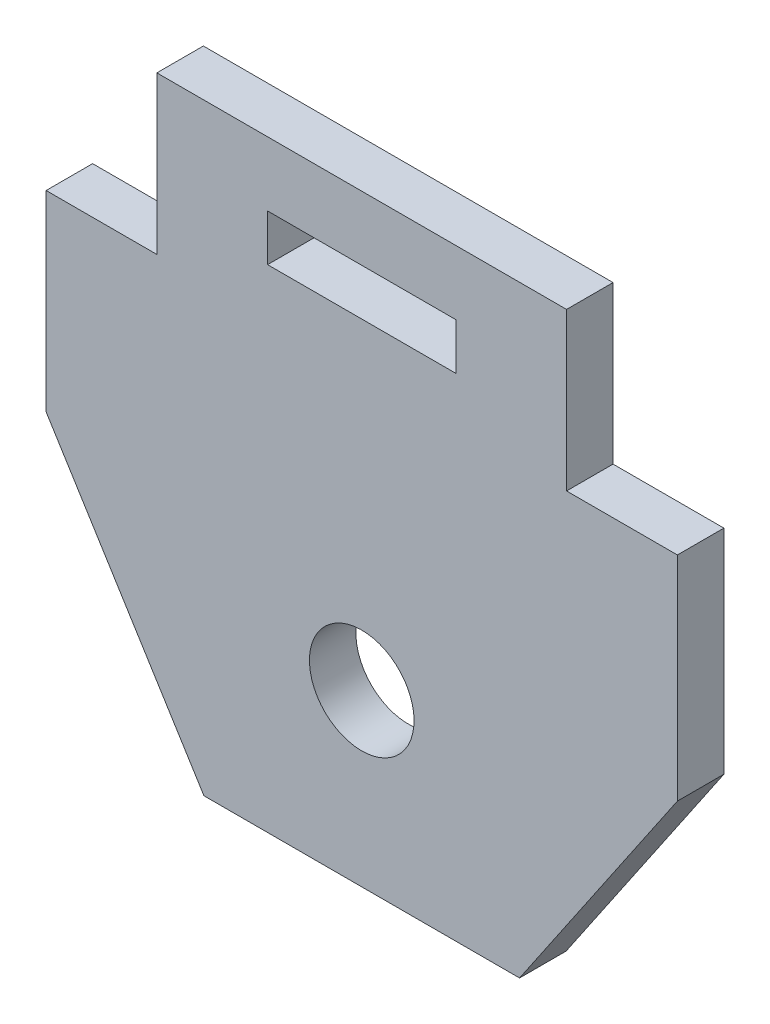
ISO-10303-21;
HEADER;
FILE_DESCRIPTION(('STEP AP214'),'2;1');
FILE_NAME('part.step','',(''),(''),'','','');
FILE_SCHEMA(('AUTOMOTIVE_DESIGN { 1 0 10303 214 1 1 1 1 }'));
ENDSEC;
DATA;
#1=APPLICATION_CONTEXT('core data for automotive mechanical design processes');
#2=APPLICATION_PROTOCOL_DEFINITION('international standard','automotive_design',2000,#1);
#3=PRODUCT_CONTEXT('',#1,'mechanical');
#4=PRODUCT('Part','Part','',(#3));
#5=PRODUCT_RELATED_PRODUCT_CATEGORY('part','',(#4));
#6=PRODUCT_DEFINITION_FORMATION('','',#4);
#7=PRODUCT_DEFINITION_CONTEXT('part definition',#1,'design');
#8=PRODUCT_DEFINITION('design','',#6,#7);
#9=PRODUCT_DEFINITION_SHAPE('','',#8);
#10=(LENGTH_UNIT() NAMED_UNIT(*) SI_UNIT(.MILLI.,.METRE.));
#11=(NAMED_UNIT(*) PLANE_ANGLE_UNIT() SI_UNIT($,.RADIAN.));
#12=(NAMED_UNIT(*) SI_UNIT($,.STERADIAN.) SOLID_ANGLE_UNIT());
#13=UNCERTAINTY_MEASURE_WITH_UNIT(LENGTH_MEASURE(1.E-05),#10,'distance_accuracy_value','');
#14=(GEOMETRIC_REPRESENTATION_CONTEXT(3) GLOBAL_UNCERTAINTY_ASSIGNED_CONTEXT((#13)) GLOBAL_UNIT_ASSIGNED_CONTEXT((#10,
#11,#12)) REPRESENTATION_CONTEXT('',''));
#15=CARTESIAN_POINT('',(0.,0.,0.));
#16=DIRECTION('',(0.,0.,1.));
#17=DIRECTION('',(1.,0.,0.));
#18=AXIS2_PLACEMENT_3D('',#15,#16,#17);
#19=CARTESIAN_POINT('',(0.,0.,5.334));
#20=DIRECTION('',(0.,0.,1.));
#21=DIRECTION('',(1.,0.,0.));
#22=AXIS2_PLACEMENT_3D('',#19,#20,#21);
#23=PLANE('',#22);
#24=CARTESIAN_POINT('',(0.,-7.112000122,5.334));
#25=DIRECTION('',(0.,0.,1.));
#26=DIRECTION('',(1.,0.,0.));
#27=AXIS2_PLACEMENT_3D('',#24,#25,#26);
#28=CIRCLE('',#27,6.);
#29=CARTESIAN_POINT('',(6.,-7.112000122,5.334));
#30=VERTEX_POINT('',#29);
#31=EDGE_CURVE('E436',#30,#30,#28,.T.);
#32=ORIENTED_EDGE('',*,*,#31,.F.);
#33=EDGE_LOOP('',(#32));
#34=FACE_BOUND('',#33,.T.);
#35=DIRECTION('',(0.,-1.,0.));
#36=VECTOR('',#35,1.);
#37=CARTESIAN_POINT('',(-36.2,24.4499922231078,5.334));
#38=LINE('',#37,#36);
#39=CARTESIAN_POINT('',(-36.2,24.4499922231078,5.334));
#40=VERTEX_POINT('',#39);
#41=CARTESIAN_POINT('',(-36.2,2.46257104852757,5.334));
#42=VERTEX_POINT('',#41);
#43=EDGE_CURVE('E174',#40,#42,#38,.T.);
#44=ORIENTED_EDGE('',*,*,#43,.T.);
#45=DIRECTION('',(0.528402190306776,-0.848994184478905,0.));
#46=VECTOR('',#45,1.);
#47=CARTESIAN_POINT('',(-36.2,2.46257104852757,5.334));
#48=LINE('',#47,#46);
#49=CARTESIAN_POINT('',(-18.1,-26.6190546921732,5.334));
#50=VERTEX_POINT('',#49);
#51=EDGE_CURVE('E177',#42,#50,#48,.T.);
#52=ORIENTED_EDGE('',*,*,#51,.T.);
#53=DIRECTION('',(1.,0.,0.));
#54=VECTOR('',#53,1.);
#55=CARTESIAN_POINT('',(-18.1,-26.6190546921732,5.334));
#56=LINE('',#55,#54);
#57=CARTESIAN_POINT('',(18.1,-26.6190546921731,5.334));
#58=VERTEX_POINT('',#57);
#59=EDGE_CURVE('E180',#50,#58,#56,.T.);
#60=ORIENTED_EDGE('',*,*,#59,.T.);
#61=DIRECTION('',(0.562289799995144,0.826940252268216,0.));
#62=VECTOR('',#61,1.);
#63=CARTESIAN_POINT('',(18.1,-26.6190546921731,5.334));
#64=LINE('',#63,#62);
#65=CARTESIAN_POINT('',(36.2,-7.77689220660127E-06,5.334));
#66=VERTEX_POINT('',#65);
#67=EDGE_CURVE('E182',#58,#66,#64,.T.);
#68=ORIENTED_EDGE('',*,*,#67,.T.);
#69=DIRECTION('',(0.,1.,0.));
#70=VECTOR('',#69,1.);
#71=CARTESIAN_POINT('',(36.2,24.4499922231078,5.334));
#72=LINE('',#71,#70);
#73=CARTESIAN_POINT('',(36.2,24.4499922231078,5.334));
#74=VERTEX_POINT('',#73);
#75=EDGE_CURVE('E184',#66,#74,#72,.T.);
#76=ORIENTED_EDGE('',*,*,#75,.T.);
#77=DIRECTION('',(-1.,0.,0.));
#78=VECTOR('',#77,1.);
#79=CARTESIAN_POINT('',(23.49,24.4499922231078,5.334));
#80=LINE('',#79,#78);
#81=CARTESIAN_POINT('',(23.49,24.4499922231078,5.334));
#82=VERTEX_POINT('',#81);
#83=EDGE_CURVE('E186',#74,#82,#80,.T.);
#84=ORIENTED_EDGE('',*,*,#83,.T.);
#85=DIRECTION('',(0.,1.,0.));
#86=VECTOR('',#85,1.);
#87=CARTESIAN_POINT('',(23.49,24.4499922231078,5.334));
#88=LINE('',#87,#86);
#89=CARTESIAN_POINT('',(23.49,42.4839922231078,5.334));
#90=VERTEX_POINT('',#89);
#91=EDGE_CURVE('E188',#82,#90,#88,.T.);
#92=ORIENTED_EDGE('',*,*,#91,.T.);
#93=DIRECTION('',(-1.,0.,0.));
#94=VECTOR('',#93,1.);
#95=CARTESIAN_POINT('',(-23.5,42.4839922231078,5.334));
#96=LINE('',#95,#94);
#97=CARTESIAN_POINT('',(-23.5,42.4839922231078,5.334));
#98=VERTEX_POINT('',#97);
#99=EDGE_CURVE('E190',#90,#98,#96,.T.);
#100=ORIENTED_EDGE('',*,*,#99,.T.);
#101=DIRECTION('',(0.,-1.,0.));
#102=VECTOR('',#101,1.);
#103=CARTESIAN_POINT('',(-23.5,24.4499922231078,5.334));
#104=LINE('',#103,#102);
#105=CARTESIAN_POINT('',(-23.5,24.4499922231078,5.334));
#106=VERTEX_POINT('',#105);
#107=EDGE_CURVE('E192',#98,#106,#104,.T.);
#108=ORIENTED_EDGE('',*,*,#107,.T.);
#109=DIRECTION('',(-1.,0.,0.));
#110=VECTOR('',#109,1.);
#111=CARTESIAN_POINT('',(-36.2,24.4499922231078,5.334));
#112=LINE('',#111,#110);
#113=EDGE_CURVE('E194',#106,#40,#112,.T.);
#114=ORIENTED_EDGE('',*,*,#113,.T.);
#115=EDGE_LOOP('',(#44,#52,#60,#68,#76,#84,#92,#100,#108,#114));
#116=FACE_BOUND('',#115,.T.);
#117=DIRECTION('',(-1.,0.,0.));
#118=VECTOR('',#117,1.);
#119=CARTESIAN_POINT('',(10.79,35.118,5.334));
#120=LINE('',#119,#118);
#121=CARTESIAN_POINT('',(10.79,35.118,5.334));
#122=VERTEX_POINT('',#121);
#123=CARTESIAN_POINT('',(-10.8,35.118,5.334));
#124=VERTEX_POINT('',#123);
#125=EDGE_CURVE('E144',#122,#124,#120,.T.);
#126=ORIENTED_EDGE('',*,*,#125,.F.);
#127=DIRECTION('',(0.,1.,0.));
#128=VECTOR('',#127,1.);
#129=CARTESIAN_POINT('',(10.79,29.784,5.334));
#130=LINE('',#129,#128);
#131=CARTESIAN_POINT('',(10.79,29.784,5.334));
#132=VERTEX_POINT('',#131);
#133=EDGE_CURVE('E136',#132,#122,#130,.T.);
#134=ORIENTED_EDGE('',*,*,#133,.F.);
#135=DIRECTION('',(1.,0.,0.));
#136=VECTOR('',#135,1.);
#137=CARTESIAN_POINT('',(10.79,29.784,5.334));
#138=LINE('',#137,#136);
#139=CARTESIAN_POINT('',(-10.8,29.784,5.334));
#140=VERTEX_POINT('',#139);
#141=EDGE_CURVE('E158',#140,#132,#138,.T.);
#142=ORIENTED_EDGE('',*,*,#141,.F.);
#143=DIRECTION('',(0.,-1.,0.));
#144=VECTOR('',#143,1.);
#145=CARTESIAN_POINT('',(-10.8,29.784,5.334));
#146=LINE('',#145,#144);
#147=EDGE_CURVE('E156',#124,#140,#146,.T.);
#148=ORIENTED_EDGE('',*,*,#147,.F.);
#149=EDGE_LOOP('',(#126,#134,#142,#148));
#150=FACE_BOUND('',#149,.T.);
#151=ADVANCED_FACE('F35',(#34,#116,#150),#23,.T.);
#152=CARTESIAN_POINT('',(0.,0.,0.));
#153=DIRECTION('',(0.,0.,1.));
#154=DIRECTION('',(1.,0.,0.));
#155=AXIS2_PLACEMENT_3D('',#152,#153,#154);
#156=PLANE('',#155);
#157=CARTESIAN_POINT('',(0.,-7.112000122,0.));
#158=DIRECTION('',(0.,0.,1.));
#159=DIRECTION('',(1.,0.,0.));
#160=AXIS2_PLACEMENT_3D('',#157,#158,#159);
#161=CIRCLE('',#160,6.);
#162=CARTESIAN_POINT('',(6.,-7.112000122,0.));
#163=VERTEX_POINT('',#162);
#164=EDGE_CURVE('E164',#163,#163,#161,.T.);
#165=ORIENTED_EDGE('',*,*,#164,.T.);
#166=EDGE_LOOP('',(#165));
#167=FACE_BOUND('',#166,.T.);
#168=DIRECTION('',(0.,-1.,0.));
#169=VECTOR('',#168,1.);
#170=CARTESIAN_POINT('',(-36.2,24.4499922231078,0.));
#171=LINE('',#170,#169);
#172=CARTESIAN_POINT('',(-36.2,24.4499922231078,0.));
#173=VERTEX_POINT('',#172);
#174=CARTESIAN_POINT('',(-36.2,2.46257104852757,0.));
#175=VERTEX_POINT('',#174);
#176=EDGE_CURVE('E152',#173,#175,#171,.T.);
#177=ORIENTED_EDGE('',*,*,#176,.F.);
#178=DIRECTION('',(-1.,0.,0.));
#179=VECTOR('',#178,1.);
#180=CARTESIAN_POINT('',(-36.2,24.4499922231078,0.));
#181=LINE('',#180,#179);
#182=CARTESIAN_POINT('',(-23.5,24.4499922231078,0.));
#183=VERTEX_POINT('',#182);
#184=EDGE_CURVE('E178',#183,#173,#181,.T.);
#185=ORIENTED_EDGE('',*,*,#184,.F.);
#186=DIRECTION('',(0.,-1.,0.));
#187=VECTOR('',#186,1.);
#188=CARTESIAN_POINT('',(-23.5,24.4499922231078,0.));
#189=LINE('',#188,#187);
#190=CARTESIAN_POINT('',(-23.5,42.4839922231078,0.));
#191=VERTEX_POINT('',#190);
#192=EDGE_CURVE('E213',#191,#183,#189,.T.);
#193=ORIENTED_EDGE('',*,*,#192,.F.);
#194=DIRECTION('',(-1.,0.,0.));
#195=VECTOR('',#194,1.);
#196=CARTESIAN_POINT('',(-23.5,42.4839922231078,0.));
#197=LINE('',#196,#195);
#198=CARTESIAN_POINT('',(23.49,42.4839922231078,0.));
#199=VERTEX_POINT('',#198);
#200=EDGE_CURVE('E211',#199,#191,#197,.T.);
#201=ORIENTED_EDGE('',*,*,#200,.F.);
#202=DIRECTION('',(0.,1.,0.));
#203=VECTOR('',#202,1.);
#204=CARTESIAN_POINT('',(23.49,24.4499922231078,0.));
#205=LINE('',#204,#203);
#206=CARTESIAN_POINT('',(23.49,24.4499922231078,0.));
#207=VERTEX_POINT('',#206);
#208=EDGE_CURVE('E209',#207,#199,#205,.T.);
#209=ORIENTED_EDGE('',*,*,#208,.F.);
#210=DIRECTION('',(-1.,0.,0.));
#211=VECTOR('',#210,1.);
#212=CARTESIAN_POINT('',(23.49,24.4499922231078,0.));
#213=LINE('',#212,#211);
#214=CARTESIAN_POINT('',(36.2,24.4499922231078,0.));
#215=VERTEX_POINT('',#214);
#216=EDGE_CURVE('E207',#215,#207,#213,.T.);
#217=ORIENTED_EDGE('',*,*,#216,.F.);
#218=DIRECTION('',(0.,1.,0.));
#219=VECTOR('',#218,1.);
#220=CARTESIAN_POINT('',(36.2,24.4499922231078,0.));
#221=LINE('',#220,#219);
#222=CARTESIAN_POINT('',(36.2,-7.77689220660127E-06,0.));
#223=VERTEX_POINT('',#222);
#224=EDGE_CURVE('E205',#223,#215,#221,.T.);
#225=ORIENTED_EDGE('',*,*,#224,.F.);
#226=DIRECTION('',(0.562289799995144,0.826940252268216,0.));
#227=VECTOR('',#226,1.);
#228=CARTESIAN_POINT('',(18.1,-26.6190546921731,0.));
#229=LINE('',#228,#227);
#230=CARTESIAN_POINT('',(18.1,-26.6190546921731,0.));
#231=VERTEX_POINT('',#230);
#232=EDGE_CURVE('E203',#231,#223,#229,.T.);
#233=ORIENTED_EDGE('',*,*,#232,.F.);
#234=DIRECTION('',(1.,0.,0.));
#235=VECTOR('',#234,1.);
#236=CARTESIAN_POINT('',(-18.1,-26.6190546921732,0.));
#237=LINE('',#236,#235);
#238=CARTESIAN_POINT('',(-18.1,-26.6190546921732,0.));
#239=VERTEX_POINT('',#238);
#240=EDGE_CURVE('E201',#239,#231,#237,.T.);
#241=ORIENTED_EDGE('',*,*,#240,.F.);
#242=DIRECTION('',(0.528402190306776,-0.848994184478905,0.));
#243=VECTOR('',#242,1.);
#244=CARTESIAN_POINT('',(-36.2,2.46257104852757,0.));
#245=LINE('',#244,#243);
#246=EDGE_CURVE('E199',#175,#239,#245,.T.);
#247=ORIENTED_EDGE('',*,*,#246,.F.);
#248=EDGE_LOOP('',(#177,#185,#193,#201,#209,#217,#225,#233,#241,#247));
#249=FACE_BOUND('',#248,.T.);
#250=DIRECTION('',(0.,1.,0.));
#251=VECTOR('',#250,1.);
#252=CARTESIAN_POINT('',(10.79,29.784,0.));
#253=LINE('',#252,#251);
#254=CARTESIAN_POINT('',(10.79,29.784,0.));
#255=VERTEX_POINT('',#254);
#256=CARTESIAN_POINT('',(10.79,35.118,0.));
#257=VERTEX_POINT('',#256);
#258=EDGE_CURVE('E58',#255,#257,#253,.T.);
#259=ORIENTED_EDGE('',*,*,#258,.T.);
#260=DIRECTION('',(-1.,0.,0.));
#261=VECTOR('',#260,1.);
#262=CARTESIAN_POINT('',(10.79,35.118,0.));
#263=LINE('',#262,#261);
#264=CARTESIAN_POINT('',(-10.8,35.118,0.));
#265=VERTEX_POINT('',#264);
#266=EDGE_CURVE('E151',#257,#265,#263,.T.);
#267=ORIENTED_EDGE('',*,*,#266,.T.);
#268=DIRECTION('',(0.,-1.,0.));
#269=VECTOR('',#268,1.);
#270=CARTESIAN_POINT('',(-10.8,29.784,0.));
#271=LINE('',#270,#269);
#272=CARTESIAN_POINT('',(-10.8,29.784,0.));
#273=VERTEX_POINT('',#272);
#274=EDGE_CURVE('E166',#265,#273,#271,.T.);
#275=ORIENTED_EDGE('',*,*,#274,.T.);
#276=DIRECTION('',(1.,0.,0.));
#277=VECTOR('',#276,1.);
#278=CARTESIAN_POINT('',(10.79,29.784,0.));
#279=LINE('',#278,#277);
#280=EDGE_CURVE('E145',#273,#255,#279,.T.);
#281=ORIENTED_EDGE('',*,*,#280,.T.);
#282=EDGE_LOOP('',(#259,#267,#275,#281));
#283=FACE_BOUND('',#282,.T.);
#284=ADVANCED_FACE('F249',(#167,#249,#283),#156,.F.);
#285=CARTESIAN_POINT('',(-36.2,24.4499922231078,5.334));
#286=DIRECTION('',(1.,0.,0.));
#287=DIRECTION('',(0.,0.,-1.));
#288=AXIS2_PLACEMENT_3D('',#285,#286,#287);
#289=PLANE('',#288);
#290=ORIENTED_EDGE('',*,*,#176,.T.);
#291=DIRECTION('',(0.,0.,-1.));
#292=VECTOR('',#291,1.);
#293=CARTESIAN_POINT('',(-36.2,2.46257104852757,5.334));
#294=LINE('',#293,#292);
#295=EDGE_CURVE('E11',#42,#175,#294,.T.);
#296=ORIENTED_EDGE('',*,*,#295,.F.);
#297=ORIENTED_EDGE('',*,*,#43,.F.);
#298=DIRECTION('',(0.,0.,-1.));
#299=VECTOR('',#298,1.);
#300=CARTESIAN_POINT('',(-36.2,24.4499922231078,5.334));
#301=LINE('',#300,#299);
#302=EDGE_CURVE('E196',#40,#173,#301,.T.);
#303=ORIENTED_EDGE('',*,*,#302,.T.);
#304=EDGE_LOOP('',(#290,#296,#297,#303));
#305=FACE_BOUND('',#304,.T.);
#306=ADVANCED_FACE('F37',(#305),#289,.F.);
#307=CARTESIAN_POINT('',(-36.2,2.46257104852757,5.334));
#308=DIRECTION('',(0.848994184478905,0.528402190306776,0.));
#309=DIRECTION('',(-0.528402190306776,0.848994184478905,0.));
#310=AXIS2_PLACEMENT_3D('',#307,#308,#309);
#311=PLANE('',#310);
#312=ORIENTED_EDGE('',*,*,#246,.T.);
#313=DIRECTION('',(0.,0.,-1.));
#314=VECTOR('',#313,1.);
#315=CARTESIAN_POINT('',(-18.1,-26.6190546921732,5.334));
#316=LINE('',#315,#314);
#317=EDGE_CURVE('E43',#50,#239,#316,.T.);
#318=ORIENTED_EDGE('',*,*,#317,.F.);
#319=ORIENTED_EDGE('',*,*,#51,.F.);
#320=ORIENTED_EDGE('',*,*,#295,.T.);
#321=EDGE_LOOP('',(#312,#318,#319,#320));
#322=FACE_BOUND('',#321,.T.);
#323=ADVANCED_FACE('F266',(#322),#311,.F.);
#324=CARTESIAN_POINT('',(-18.1,-26.6190546921732,5.334));
#325=DIRECTION('',(0.,1.,0.));
#326=DIRECTION('',(-1.,0.,0.));
#327=AXIS2_PLACEMENT_3D('',#324,#325,#326);
#328=PLANE('',#327);
#329=ORIENTED_EDGE('',*,*,#240,.T.);
#330=DIRECTION('',(0.,0.,-1.));
#331=VECTOR('',#330,1.);
#332=CARTESIAN_POINT('',(18.1,-26.6190546921731,5.334));
#333=LINE('',#332,#331);
#334=EDGE_CURVE('E236',#58,#231,#333,.T.);
#335=ORIENTED_EDGE('',*,*,#334,.F.);
#336=ORIENTED_EDGE('',*,*,#59,.F.);
#337=ORIENTED_EDGE('',*,*,#317,.T.);
#338=EDGE_LOOP('',(#329,#335,#336,#337));
#339=FACE_BOUND('',#338,.T.);
#340=ADVANCED_FACE('F243',(#339),#328,.F.);
#341=CARTESIAN_POINT('',(18.1,-26.6190546921731,5.334));
#342=DIRECTION('',(-0.826940252268216,0.562289799995144,0.));
#343=DIRECTION('',(-0.562289799995144,-0.826940252268216,0.));
#344=AXIS2_PLACEMENT_3D('',#341,#342,#343);
#345=PLANE('',#344);
#346=ORIENTED_EDGE('',*,*,#232,.T.);
#347=DIRECTION('',(0.,0.,-1.));
#348=VECTOR('',#347,1.);
#349=CARTESIAN_POINT('',(36.2,-7.77689220660127E-06,5.334));
#350=LINE('',#349,#348);
#351=EDGE_CURVE('E233',#66,#223,#350,.T.);
#352=ORIENTED_EDGE('',*,*,#351,.F.);
#353=ORIENTED_EDGE('',*,*,#67,.F.);
#354=ORIENTED_EDGE('',*,*,#334,.T.);
#355=EDGE_LOOP('',(#346,#352,#353,#354));
#356=FACE_BOUND('',#355,.T.);
#357=ADVANCED_FACE('F255',(#356),#345,.F.);
#358=CARTESIAN_POINT('',(36.2,24.4499922231078,5.334));
#359=DIRECTION('',(-1.,0.,0.));
#360=DIRECTION('',(0.,0.,1.));
#361=AXIS2_PLACEMENT_3D('',#358,#359,#360);
#362=PLANE('',#361);
#363=ORIENTED_EDGE('',*,*,#224,.T.);
#364=DIRECTION('',(0.,0.,-1.));
#365=VECTOR('',#364,1.);
#366=CARTESIAN_POINT('',(36.2,24.4499922231078,5.334));
#367=LINE('',#366,#365);
#368=EDGE_CURVE('E230',#74,#215,#367,.T.);
#369=ORIENTED_EDGE('',*,*,#368,.F.);
#370=ORIENTED_EDGE('',*,*,#75,.F.);
#371=ORIENTED_EDGE('',*,*,#351,.T.);
#372=EDGE_LOOP('',(#363,#369,#370,#371));
#373=FACE_BOUND('',#372,.T.);
#374=ADVANCED_FACE('F259',(#373),#362,.F.);
#375=CARTESIAN_POINT('',(23.49,24.4499922231078,5.334));
#376=DIRECTION('',(0.,-1.,0.));
#377=DIRECTION('',(0.,0.,-1.));
#378=AXIS2_PLACEMENT_3D('',#375,#376,#377);
#379=PLANE('',#378);
#380=ORIENTED_EDGE('',*,*,#216,.T.);
#381=DIRECTION('',(0.,0.,-1.));
#382=VECTOR('',#381,1.);
#383=CARTESIAN_POINT('',(23.49,24.4499922231078,5.334));
#384=LINE('',#383,#382);
#385=EDGE_CURVE('E227',#82,#207,#384,.T.);
#386=ORIENTED_EDGE('',*,*,#385,.F.);
#387=ORIENTED_EDGE('',*,*,#83,.F.);
#388=ORIENTED_EDGE('',*,*,#368,.T.);
#389=EDGE_LOOP('',(#380,#386,#387,#388));
#390=FACE_BOUND('',#389,.T.);
#391=ADVANCED_FACE('F289',(#390),#379,.F.);
#392=CARTESIAN_POINT('',(23.49,24.4499922231078,5.334));
#393=DIRECTION('',(-1.,0.,0.));
#394=DIRECTION('',(0.,0.,1.));
#395=AXIS2_PLACEMENT_3D('',#392,#393,#394);
#396=PLANE('',#395);
#397=ORIENTED_EDGE('',*,*,#208,.T.);
#398=DIRECTION('',(0.,0.,-1.));
#399=VECTOR('',#398,1.);
#400=CARTESIAN_POINT('',(23.49,42.4839922231078,5.334));
#401=LINE('',#400,#399);
#402=EDGE_CURVE('E224',#90,#199,#401,.T.);
#403=ORIENTED_EDGE('',*,*,#402,.F.);
#404=ORIENTED_EDGE('',*,*,#91,.F.);
#405=ORIENTED_EDGE('',*,*,#385,.T.);
#406=EDGE_LOOP('',(#397,#403,#404,#405));
#407=FACE_BOUND('',#406,.T.);
#408=ADVANCED_FACE('F286',(#407),#396,.F.);
#409=CARTESIAN_POINT('',(-23.5,42.4839922231078,5.334));
#410=DIRECTION('',(0.,-1.,0.));
#411=DIRECTION('',(0.,0.,-1.));
#412=AXIS2_PLACEMENT_3D('',#409,#410,#411);
#413=PLANE('',#412);
#414=ORIENTED_EDGE('',*,*,#200,.T.);
#415=DIRECTION('',(0.,0.,-1.));
#416=VECTOR('',#415,1.);
#417=CARTESIAN_POINT('',(-23.5,42.4839922231078,5.334));
#418=LINE('',#417,#416);
#419=EDGE_CURVE('E221',#98,#191,#418,.T.);
#420=ORIENTED_EDGE('',*,*,#419,.F.);
#421=ORIENTED_EDGE('',*,*,#99,.F.);
#422=ORIENTED_EDGE('',*,*,#402,.T.);
#423=EDGE_LOOP('',(#414,#420,#421,#422));
#424=FACE_BOUND('',#423,.T.);
#425=ADVANCED_FACE('F282',(#424),#413,.F.);
#426=CARTESIAN_POINT('',(-23.5,24.4499922231078,5.334));
#427=DIRECTION('',(1.,0.,0.));
#428=DIRECTION('',(0.,0.,-1.));
#429=AXIS2_PLACEMENT_3D('',#426,#427,#428);
#430=PLANE('',#429);
#431=ORIENTED_EDGE('',*,*,#192,.T.);
#432=DIRECTION('',(0.,0.,-1.));
#433=VECTOR('',#432,1.);
#434=CARTESIAN_POINT('',(-23.5,24.4499922231078,5.334));
#435=LINE('',#434,#433);
#436=EDGE_CURVE('E218',#106,#183,#435,.T.);
#437=ORIENTED_EDGE('',*,*,#436,.F.);
#438=ORIENTED_EDGE('',*,*,#107,.F.);
#439=ORIENTED_EDGE('',*,*,#419,.T.);
#440=EDGE_LOOP('',(#431,#437,#438,#439));
#441=FACE_BOUND('',#440,.T.);
#442=ADVANCED_FACE('F278',(#441),#430,.F.);
#443=CARTESIAN_POINT('',(-36.2,24.4499922231078,5.334));
#444=DIRECTION('',(0.,-1.,0.));
#445=DIRECTION('',(0.,0.,-1.));
#446=AXIS2_PLACEMENT_3D('',#443,#444,#445);
#447=PLANE('',#446);
#448=ORIENTED_EDGE('',*,*,#184,.T.);
#449=ORIENTED_EDGE('',*,*,#302,.F.);
#450=ORIENTED_EDGE('',*,*,#113,.F.);
#451=ORIENTED_EDGE('',*,*,#436,.T.);
#452=EDGE_LOOP('',(#448,#449,#450,#451));
#453=FACE_BOUND('',#452,.T.);
#454=ADVANCED_FACE('F273',(#453),#447,.F.);
#455=CARTESIAN_POINT('',(10.79,29.784,5.334));
#456=DIRECTION('',(-1.,0.,0.));
#457=DIRECTION('',(0.,0.,1.));
#458=AXIS2_PLACEMENT_3D('',#455,#456,#457);
#459=PLANE('',#458);
#460=ORIENTED_EDGE('',*,*,#258,.F.);
#461=DIRECTION('',(0.,0.,-1.));
#462=VECTOR('',#461,1.);
#463=CARTESIAN_POINT('',(10.79,29.784,5.334));
#464=LINE('',#463,#462);
#465=EDGE_CURVE('E140',#132,#255,#464,.T.);
#466=ORIENTED_EDGE('',*,*,#465,.F.);
#467=ORIENTED_EDGE('',*,*,#133,.T.);
#468=DIRECTION('',(0.,0.,-1.));
#469=VECTOR('',#468,1.);
#470=CARTESIAN_POINT('',(10.79,35.118,5.334));
#471=LINE('',#470,#469);
#472=EDGE_CURVE('E139',#122,#257,#471,.T.);
#473=ORIENTED_EDGE('',*,*,#472,.T.);
#474=EDGE_LOOP('',(#460,#466,#467,#473));
#475=FACE_BOUND('',#474,.T.);
#476=ADVANCED_FACE('F138',(#475),#459,.T.);
#477=CARTESIAN_POINT('',(10.79,35.118,5.334));
#478=DIRECTION('',(0.,-1.,0.));
#479=DIRECTION('',(0.,0.,-1.));
#480=AXIS2_PLACEMENT_3D('',#477,#478,#479);
#481=PLANE('',#480);
#482=ORIENTED_EDGE('',*,*,#266,.F.);
#483=ORIENTED_EDGE('',*,*,#472,.F.);
#484=ORIENTED_EDGE('',*,*,#125,.T.);
#485=DIRECTION('',(0.,0.,-1.));
#486=VECTOR('',#485,1.);
#487=CARTESIAN_POINT('',(-10.8,35.118,5.334));
#488=LINE('',#487,#486);
#489=EDGE_CURVE('E153',#124,#265,#488,.T.);
#490=ORIENTED_EDGE('',*,*,#489,.T.);
#491=EDGE_LOOP('',(#482,#483,#484,#490));
#492=FACE_BOUND('',#491,.T.);
#493=ADVANCED_FACE('F148',(#492),#481,.T.);
#494=CARTESIAN_POINT('',(-10.8,29.784,5.334));
#495=DIRECTION('',(1.,0.,0.));
#496=DIRECTION('',(0.,0.,-1.));
#497=AXIS2_PLACEMENT_3D('',#494,#495,#496);
#498=PLANE('',#497);
#499=ORIENTED_EDGE('',*,*,#274,.F.);
#500=ORIENTED_EDGE('',*,*,#489,.F.);
#501=ORIENTED_EDGE('',*,*,#147,.T.);
#502=DIRECTION('',(0.,0.,-1.));
#503=VECTOR('',#502,1.);
#504=CARTESIAN_POINT('',(-10.8,29.784,5.334));
#505=LINE('',#504,#503);
#506=EDGE_CURVE('E50',#140,#273,#505,.T.);
#507=ORIENTED_EDGE('',*,*,#506,.T.);
#508=EDGE_LOOP('',(#499,#500,#501,#507));
#509=FACE_BOUND('',#508,.T.);
#510=ADVANCED_FACE('F338',(#509),#498,.T.);
#511=CARTESIAN_POINT('',(10.79,29.784,5.334));
#512=DIRECTION('',(0.,1.,0.));
#513=DIRECTION('',(0.,0.,1.));
#514=AXIS2_PLACEMENT_3D('',#511,#512,#513);
#515=PLANE('',#514);
#516=ORIENTED_EDGE('',*,*,#280,.F.);
#517=ORIENTED_EDGE('',*,*,#506,.F.);
#518=ORIENTED_EDGE('',*,*,#141,.T.);
#519=ORIENTED_EDGE('',*,*,#465,.T.);
#520=EDGE_LOOP('',(#516,#517,#518,#519));
#521=FACE_BOUND('',#520,.T.);
#522=ADVANCED_FACE('F344',(#521),#515,.T.);
#523=CARTESIAN_POINT('',(0.,-7.112000122,0.));
#524=DIRECTION('',(0.,0.,1.));
#525=DIRECTION('',(1.,0.,0.));
#526=AXIS2_PLACEMENT_3D('',#523,#524,#525);
#527=CYLINDRICAL_SURFACE('',#526,6.);
#528=ORIENTED_EDGE('',*,*,#164,.F.);
#529=EDGE_LOOP('',(#528));
#530=FACE_BOUND('',#529,.T.);
#531=ORIENTED_EDGE('',*,*,#31,.T.);
#532=EDGE_LOOP('',(#531));
#533=FACE_BOUND('',#532,.T.);
#534=ADVANCED_FACE('F352',(#530,#533),#527,.F.);
#535=CLOSED_SHELL('',(#151,#284,#306,#323,#340,#357,#374,#391,#408,#425,#442,#454,#476,#493,
#510,#522,#534));
#536=MANIFOLD_SOLID_BREP('B2',#535);
#537=ADVANCED_BREP_SHAPE_REPRESENTATION('',(#18,#536),#14);
#538=SHAPE_DEFINITION_REPRESENTATION(#9,#537);
ENDSEC;
END-ISO-10303-21;
